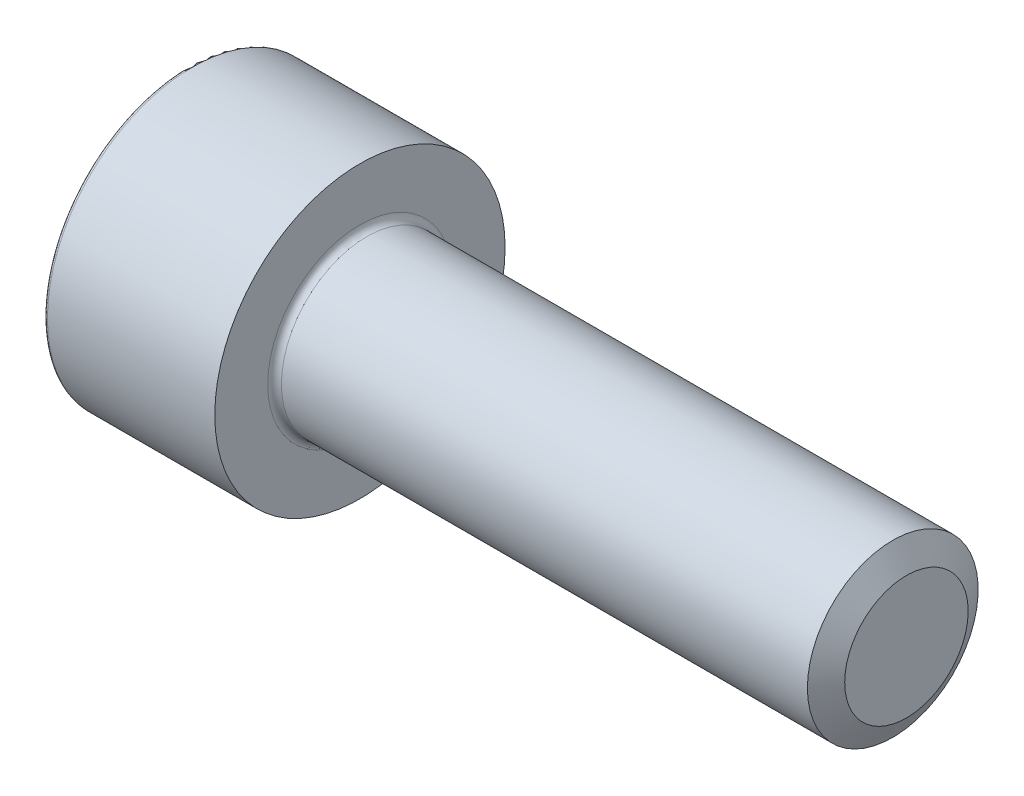
ISO-10303-21;
HEADER;
FILE_DESCRIPTION(('STEP AP214'),'2;1');
FILE_NAME('part.step','',(''),(''),'','','');
FILE_SCHEMA(('AUTOMOTIVE_DESIGN { 1 0 10303 214 1 1 1 1 }'));
ENDSEC;
DATA;
#1=APPLICATION_CONTEXT('core data for automotive mechanical design processes');
#2=APPLICATION_PROTOCOL_DEFINITION('international standard','automotive_design',2000,#1);
#3=PRODUCT_CONTEXT('',#1,'mechanical');
#4=PRODUCT('Part','Part','',(#3));
#5=PRODUCT_RELATED_PRODUCT_CATEGORY('part','',(#4));
#6=PRODUCT_DEFINITION_FORMATION('','',#4);
#7=PRODUCT_DEFINITION_CONTEXT('part definition',#1,'design');
#8=PRODUCT_DEFINITION('design','',#6,#7);
#9=PRODUCT_DEFINITION_SHAPE('','',#8);
#10=(LENGTH_UNIT() NAMED_UNIT(*) SI_UNIT(.MILLI.,.METRE.));
#11=(NAMED_UNIT(*) PLANE_ANGLE_UNIT() SI_UNIT($,.RADIAN.));
#12=(NAMED_UNIT(*) SI_UNIT($,.STERADIAN.) SOLID_ANGLE_UNIT());
#13=UNCERTAINTY_MEASURE_WITH_UNIT(LENGTH_MEASURE(1.E-05),#10,'distance_accuracy_value','');
#14=(GEOMETRIC_REPRESENTATION_CONTEXT(3) GLOBAL_UNCERTAINTY_ASSIGNED_CONTEXT((#13)) GLOBAL_UNIT_ASSIGNED_CONTEXT((#10,
#11,#12)) REPRESENTATION_CONTEXT('',''));
#15=CARTESIAN_POINT('',(0.,0.,0.));
#16=DIRECTION('',(0.,0.,1.));
#17=DIRECTION('',(1.,0.,0.));
#18=AXIS2_PLACEMENT_3D('',#15,#16,#17);
#19=CARTESIAN_POINT('',(0.,0.,0.));
#20=DIRECTION('',(-1.,0.,0.));
#21=DIRECTION('',(0.,0.,1.));
#22=AXIS2_PLACEMENT_3D('',#19,#20,#21);
#23=CYLINDRICAL_SURFACE('',#22,2.5);
#24=CARTESIAN_POINT('',(5.2,0.,0.));
#25=DIRECTION('',(-1.,0.,0.));
#26=DIRECTION('',(0.,0.,1.));
#27=AXIS2_PLACEMENT_3D('',#24,#25,#26);
#28=CIRCLE('',#27,2.5);
#29=CARTESIAN_POINT('',(5.2,0.,2.5));
#30=VERTEX_POINT('',#29);
#31=EDGE_CURVE('E159',#30,#30,#28,.T.);
#32=ORIENTED_EDGE('',*,*,#31,.F.);
#33=EDGE_LOOP('',(#32));
#34=FACE_BOUND('',#33,.T.);
#35=CARTESIAN_POINT('',(20.6000117335054,0.,0.));
#36=DIRECTION('',(-1.,0.,0.));
#37=DIRECTION('',(0.,0.,1.));
#38=AXIS2_PLACEMENT_3D('',#35,#36,#37);
#39=CIRCLE('',#38,2.5);
#40=CARTESIAN_POINT('',(20.6000117335054,0.,2.5));
#41=VERTEX_POINT('',#40);
#42=EDGE_CURVE('E293',#41,#41,#39,.T.);
#43=ORIENTED_EDGE('',*,*,#42,.T.);
#44=EDGE_LOOP('',(#43));
#45=FACE_BOUND('',#44,.T.);
#46=ADVANCED_FACE('F42',(#34,#45),#23,.T.);
#47=CARTESIAN_POINT('',(0.,0.,0.));
#48=DIRECTION('',(1.,0.,0.));
#49=DIRECTION('',(0.,0.,-1.));
#50=AXIS2_PLACEMENT_3D('',#47,#48,#49);
#51=PLANE('',#50);
#52=CARTESIAN_POINT('',(0.,0.,0.));
#53=DIRECTION('',(1.,0.,0.));
#54=DIRECTION('',(0.,0.,-1.));
#55=AXIS2_PLACEMENT_3D('',#52,#53,#54);
#56=CIRCLE('',#55,4.15);
#57=CARTESIAN_POINT('',(0.,0.,-4.15));
#58=VERTEX_POINT('',#57);
#59=EDGE_CURVE('E51',#58,#58,#56,.F.);
#60=ORIENTED_EDGE('',*,*,#59,.T.);
#61=EDGE_LOOP('',(#60));
#62=FACE_BOUND('',#61,.T.);
#63=DIRECTION('',(0.,0.866025403784439,-0.5));
#64=VECTOR('',#63,1.);
#65=CARTESIAN_POINT('',(0.,0.,2.29));
#66=LINE('',#65,#64);
#67=CARTESIAN_POINT('',(0.,0.,2.29));
#68=VERTEX_POINT('',#67);
#69=CARTESIAN_POINT('',(0.,1.98319817466637,1.145));
#70=VERTEX_POINT('',#69);
#71=EDGE_CURVE('E139',#68,#70,#66,.T.);
#72=ORIENTED_EDGE('',*,*,#71,.F.);
#73=DIRECTION('',(0.,0.866025403784439,0.5));
#74=VECTOR('',#73,1.);
#75=CARTESIAN_POINT('',(0.,-1.98319817466637,1.145));
#76=LINE('',#75,#74);
#77=CARTESIAN_POINT('',(0.,-1.98319817466637,1.145));
#78=VERTEX_POINT('',#77);
#79=EDGE_CURVE('E58',#78,#68,#76,.T.);
#80=ORIENTED_EDGE('',*,*,#79,.F.);
#81=DIRECTION('',(0.,0.,1.));
#82=VECTOR('',#81,1.);
#83=CARTESIAN_POINT('',(0.,-1.98319817466636,-1.145));
#84=LINE('',#83,#82);
#85=CARTESIAN_POINT('',(0.,-1.98319817466636,-1.145));
#86=VERTEX_POINT('',#85);
#87=EDGE_CURVE('E153',#86,#78,#84,.T.);
#88=ORIENTED_EDGE('',*,*,#87,.F.);
#89=DIRECTION('',(0.,-0.866025403784438,0.5));
#90=VECTOR('',#89,1.);
#91=CARTESIAN_POINT('',(0.,0.,-2.29));
#92=LINE('',#91,#90);
#93=CARTESIAN_POINT('',(0.,0.,-2.29));
#94=VERTEX_POINT('',#93);
#95=EDGE_CURVE('E150',#94,#86,#92,.T.);
#96=ORIENTED_EDGE('',*,*,#95,.F.);
#97=DIRECTION('',(0.,-0.866025403784439,-0.5));
#98=VECTOR('',#97,1.);
#99=CARTESIAN_POINT('',(0.,1.98319817466636,-1.145));
#100=LINE('',#99,#98);
#101=CARTESIAN_POINT('',(0.,1.98319817466636,-1.145));
#102=VERTEX_POINT('',#101);
#103=EDGE_CURVE('E106',#102,#94,#100,.T.);
#104=ORIENTED_EDGE('',*,*,#103,.F.);
#105=DIRECTION('',(0.,0.,-1.));
#106=VECTOR('',#105,1.);
#107=CARTESIAN_POINT('',(0.,1.98319817466637,1.145));
#108=LINE('',#107,#106);
#109=EDGE_CURVE('E144',#70,#102,#108,.T.);
#110=ORIENTED_EDGE('',*,*,#109,.F.);
#111=EDGE_LOOP('',(#72,#80,#88,#96,#104,#110));
#112=FACE_BOUND('',#111,.T.);
#113=ADVANCED_FACE('F183',(#62,#112),#51,.F.);
#114=CARTESIAN_POINT('',(0.,0.,0.));
#115=DIRECTION('',(-1.,0.,0.));
#116=DIRECTION('',(0.,0.,1.));
#117=AXIS2_PLACEMENT_3D('',#114,#115,#116);
#118=CYLINDRICAL_SURFACE('',#117,4.25);
#119=CARTESIAN_POINT('',(0.1,0.,0.));
#120=DIRECTION('',(1.,0.,0.));
#121=DIRECTION('',(0.,0.,-1.));
#122=AXIS2_PLACEMENT_3D('',#119,#120,#121);
#123=CIRCLE('',#122,4.25);
#124=CARTESIAN_POINT('',(0.1,0.,-4.25));
#125=VERTEX_POINT('',#124);
#126=EDGE_CURVE('E11',#125,#125,#123,.T.);
#127=ORIENTED_EDGE('',*,*,#126,.T.);
#128=EDGE_LOOP('',(#127));
#129=FACE_BOUND('',#128,.T.);
#130=CARTESIAN_POINT('',(5.,0.,0.));
#131=DIRECTION('',(-1.,0.,0.));
#132=DIRECTION('',(0.,0.,1.));
#133=AXIS2_PLACEMENT_3D('',#130,#131,#132);
#134=CIRCLE('',#133,4.25);
#135=CARTESIAN_POINT('',(5.,0.,4.25));
#136=VERTEX_POINT('',#135);
#137=EDGE_CURVE('E175',#136,#136,#134,.T.);
#138=ORIENTED_EDGE('',*,*,#137,.T.);
#139=EDGE_LOOP('',(#138));
#140=FACE_BOUND('',#139,.T.);
#141=ADVANCED_FACE('F202',(#129,#140),#118,.T.);
#142=CARTESIAN_POINT('',(5.,4.25,0.));
#143=DIRECTION('',(-1.,0.,0.));
#144=DIRECTION('',(0.,0.,1.));
#145=AXIS2_PLACEMENT_3D('',#142,#143,#144);
#146=PLANE('',#145);
#147=ORIENTED_EDGE('',*,*,#137,.F.);
#148=EDGE_LOOP('',(#147));
#149=FACE_BOUND('',#148,.T.);
#150=CARTESIAN_POINT('',(5.,0.,0.));
#151=DIRECTION('',(-1.,0.,0.));
#152=DIRECTION('',(0.,0.,1.));
#153=AXIS2_PLACEMENT_3D('',#150,#151,#152);
#154=CIRCLE('',#153,2.7);
#155=CARTESIAN_POINT('',(5.,0.,2.7));
#156=VERTEX_POINT('',#155);
#157=EDGE_CURVE('E171',#156,#156,#154,.T.);
#158=ORIENTED_EDGE('',*,*,#157,.T.);
#159=EDGE_LOOP('',(#158));
#160=FACE_BOUND('',#159,.T.);
#161=ADVANCED_FACE('F211',(#149,#160),#146,.F.);
#162=CARTESIAN_POINT('',(5.2,0.,0.));
#163=DIRECTION('',(-1.,0.,0.));
#164=DIRECTION('',(0.,0.,1.));
#165=AXIS2_PLACEMENT_3D('',#162,#163,#164);
#166=TOROIDAL_SURFACE('',#165,2.7,0.2);
#167=ORIENTED_EDGE('',*,*,#157,.F.);
#168=EDGE_LOOP('',(#167));
#169=FACE_BOUND('',#168,.T.);
#170=ORIENTED_EDGE('',*,*,#31,.T.);
#171=EDGE_LOOP('',(#170));
#172=FACE_BOUND('',#171,.T.);
#173=ADVANCED_FACE('F207',(#169,#172),#166,.F.);
#174=CARTESIAN_POINT('',(2.5,-1.98319817466637,1.145));
#175=DIRECTION('',(0.,-0.5,0.866025403784439));
#176=DIRECTION('',(0.,-0.866025403784439,-0.5));
#177=AXIS2_PLACEMENT_3D('',#174,#175,#176);
#178=PLANE('',#177);
#179=ORIENTED_EDGE('',*,*,#79,.T.);
#180=DIRECTION('',(-1.,0.,0.));
#181=VECTOR('',#180,1.);
#182=CARTESIAN_POINT('',(2.5,0.,2.29));
#183=LINE('',#182,#181);
#184=CARTESIAN_POINT('',(2.5,0.,2.29));
#185=VERTEX_POINT('',#184);
#186=EDGE_CURVE('E88',#185,#68,#183,.T.);
#187=ORIENTED_EDGE('',*,*,#186,.F.);
#188=DIRECTION('',(0.,0.866025403784439,0.5));
#189=VECTOR('',#188,1.);
#190=CARTESIAN_POINT('',(2.5,-1.98319817466637,1.145));
#191=LINE('',#190,#189);
#192=CARTESIAN_POINT('',(2.5,-1.98319817466637,1.145));
#193=VERTEX_POINT('',#192);
#194=EDGE_CURVE('E156',#193,#185,#191,.T.);
#195=ORIENTED_EDGE('',*,*,#194,.F.);
#196=DIRECTION('',(-1.,0.,0.));
#197=VECTOR('',#196,1.);
#198=CARTESIAN_POINT('',(2.5,-1.98319817466637,1.145));
#199=LINE('',#198,#197);
#200=EDGE_CURVE('E66',#193,#78,#199,.T.);
#201=ORIENTED_EDGE('',*,*,#200,.T.);
#202=EDGE_LOOP('',(#179,#187,#195,#201));
#203=FACE_BOUND('',#202,.T.);
#204=ADVANCED_FACE('F210',(#203),#178,.F.);
#205=CARTESIAN_POINT('',(2.5,-1.98319817466636,-1.145));
#206=DIRECTION('',(0.,-1.,0.));
#207=DIRECTION('',(0.,0.,-1.));
#208=AXIS2_PLACEMENT_3D('',#205,#206,#207);
#209=PLANE('',#208);
#210=ORIENTED_EDGE('',*,*,#87,.T.);
#211=ORIENTED_EDGE('',*,*,#200,.F.);
#212=DIRECTION('',(0.,0.,1.));
#213=VECTOR('',#212,1.);
#214=CARTESIAN_POINT('',(2.5,-1.98319817466636,-1.145));
#215=LINE('',#214,#213);
#216=CARTESIAN_POINT('',(2.5,-1.98319817466636,-1.145));
#217=VERTEX_POINT('',#216);
#218=EDGE_CURVE('E120',#217,#193,#215,.T.);
#219=ORIENTED_EDGE('',*,*,#218,.F.);
#220=DIRECTION('',(-1.,0.,0.));
#221=VECTOR('',#220,1.);
#222=CARTESIAN_POINT('',(2.5,-1.98319817466636,-1.145));
#223=LINE('',#222,#221);
#224=EDGE_CURVE('E111',#217,#86,#223,.T.);
#225=ORIENTED_EDGE('',*,*,#224,.T.);
#226=EDGE_LOOP('',(#210,#211,#219,#225));
#227=FACE_BOUND('',#226,.T.);
#228=ADVANCED_FACE('F239',(#227),#209,.F.);
#229=CARTESIAN_POINT('',(2.5,0.,-2.29));
#230=DIRECTION('',(0.,-0.5,-0.866025403784439));
#231=DIRECTION('',(0.,0.866025403784439,-0.5));
#232=AXIS2_PLACEMENT_3D('',#229,#230,#231);
#233=PLANE('',#232);
#234=ORIENTED_EDGE('',*,*,#95,.T.);
#235=ORIENTED_EDGE('',*,*,#224,.F.);
#236=DIRECTION('',(0.,-0.866025403784438,0.5));
#237=VECTOR('',#236,1.);
#238=CARTESIAN_POINT('',(2.5,0.,-2.29));
#239=LINE('',#238,#237);
#240=CARTESIAN_POINT('',(2.5,0.,-2.29));
#241=VERTEX_POINT('',#240);
#242=EDGE_CURVE('E115',#241,#217,#239,.T.);
#243=ORIENTED_EDGE('',*,*,#242,.F.);
#244=DIRECTION('',(-1.,0.,0.));
#245=VECTOR('',#244,1.);
#246=CARTESIAN_POINT('',(2.5,0.,-2.29));
#247=LINE('',#246,#245);
#248=EDGE_CURVE('E99',#241,#94,#247,.T.);
#249=ORIENTED_EDGE('',*,*,#248,.T.);
#250=EDGE_LOOP('',(#234,#235,#243,#249));
#251=FACE_BOUND('',#250,.T.);
#252=ADVANCED_FACE('F116',(#251),#233,.F.);
#253=CARTESIAN_POINT('',(2.5,1.98319817466636,-1.145));
#254=DIRECTION('',(0.,0.5,-0.866025403784439));
#255=DIRECTION('',(0.,0.866025403784439,0.5));
#256=AXIS2_PLACEMENT_3D('',#253,#254,#255);
#257=PLANE('',#256);
#258=ORIENTED_EDGE('',*,*,#103,.T.);
#259=ORIENTED_EDGE('',*,*,#248,.F.);
#260=DIRECTION('',(0.,-0.866025403784439,-0.5));
#261=VECTOR('',#260,1.);
#262=CARTESIAN_POINT('',(2.5,1.98319817466636,-1.145));
#263=LINE('',#262,#261);
#264=CARTESIAN_POINT('',(2.5,1.98319817466636,-1.145));
#265=VERTEX_POINT('',#264);
#266=EDGE_CURVE('E103',#265,#241,#263,.T.);
#267=ORIENTED_EDGE('',*,*,#266,.F.);
#268=DIRECTION('',(-1.,0.,0.));
#269=VECTOR('',#268,1.);
#270=CARTESIAN_POINT('',(2.5,1.98319817466636,-1.145));
#271=LINE('',#270,#269);
#272=EDGE_CURVE('E112',#265,#102,#271,.T.);
#273=ORIENTED_EDGE('',*,*,#272,.T.);
#274=EDGE_LOOP('',(#258,#259,#267,#273));
#275=FACE_BOUND('',#274,.T.);
#276=ADVANCED_FACE('F101',(#275),#257,.F.);
#277=CARTESIAN_POINT('',(2.5,1.98319817466637,1.145));
#278=DIRECTION('',(0.,1.,0.));
#279=DIRECTION('',(0.,0.,1.));
#280=AXIS2_PLACEMENT_3D('',#277,#278,#279);
#281=PLANE('',#280);
#282=ORIENTED_EDGE('',*,*,#109,.T.);
#283=ORIENTED_EDGE('',*,*,#272,.F.);
#284=DIRECTION('',(0.,0.,-1.));
#285=VECTOR('',#284,1.);
#286=CARTESIAN_POINT('',(2.5,1.98319817466637,1.145));
#287=LINE('',#286,#285);
#288=CARTESIAN_POINT('',(2.5,1.98319817466637,1.145));
#289=VERTEX_POINT('',#288);
#290=EDGE_CURVE('E126',#289,#265,#287,.T.);
#291=ORIENTED_EDGE('',*,*,#290,.F.);
#292=DIRECTION('',(-1.,0.,0.));
#293=VECTOR('',#292,1.);
#294=CARTESIAN_POINT('',(2.5,1.98319817466637,1.145));
#295=LINE('',#294,#293);
#296=EDGE_CURVE('E163',#289,#70,#295,.T.);
#297=ORIENTED_EDGE('',*,*,#296,.T.);
#298=EDGE_LOOP('',(#282,#283,#291,#297));
#299=FACE_BOUND('',#298,.T.);
#300=ADVANCED_FACE('F254',(#299),#281,.F.);
#301=CARTESIAN_POINT('',(2.5,0.,2.29));
#302=DIRECTION('',(0.,0.5,0.866025403784438));
#303=DIRECTION('',(0.,-0.866025403784438,0.5));
#304=AXIS2_PLACEMENT_3D('',#301,#302,#303);
#305=PLANE('',#304);
#306=ORIENTED_EDGE('',*,*,#71,.T.);
#307=ORIENTED_EDGE('',*,*,#296,.F.);
#308=DIRECTION('',(0.,0.866025403784439,-0.5));
#309=VECTOR('',#308,1.);
#310=CARTESIAN_POINT('',(2.5,0.,2.29));
#311=LINE('',#310,#309);
#312=EDGE_CURVE('E131',#185,#289,#311,.T.);
#313=ORIENTED_EDGE('',*,*,#312,.F.);
#314=ORIENTED_EDGE('',*,*,#186,.T.);
#315=EDGE_LOOP('',(#306,#307,#313,#314));
#316=FACE_BOUND('',#315,.T.);
#317=ADVANCED_FACE('F260',(#316),#305,.F.);
#318=CARTESIAN_POINT('',(2.5,-1.98319817466637,1.145));
#319=DIRECTION('',(1.,0.,0.));
#320=DIRECTION('',(0.,0.,-1.));
#321=AXIS2_PLACEMENT_3D('',#318,#319,#320);
#322=PLANE('',#321);
#323=ORIENTED_EDGE('',*,*,#194,.T.);
#324=ORIENTED_EDGE('',*,*,#312,.T.);
#325=ORIENTED_EDGE('',*,*,#290,.T.);
#326=ORIENTED_EDGE('',*,*,#266,.T.);
#327=ORIENTED_EDGE('',*,*,#242,.T.);
#328=ORIENTED_EDGE('',*,*,#218,.T.);
#329=EDGE_LOOP('',(#323,#324,#325,#326,#327,#328));
#330=FACE_BOUND('',#329,.T.);
#331=ADVANCED_FACE('F123',(#330),#322,.F.);
#332=CARTESIAN_POINT('',(20.6000117335054,0.,0.));
#333=DIRECTION('',(-1.,0.,0.));
#334=DIRECTION('',(0.,0.,1.));
#335=AXIS2_PLACEMENT_3D('',#332,#333,#334);
#336=CONICAL_SURFACE('',#335,2.5,1.04719755119659);
#337=CARTESIAN_POINT('',(21.,0.,0.));
#338=DIRECTION('',(-1.,0.,0.));
#339=DIRECTION('',(0.,0.,1.));
#340=AXIS2_PLACEMENT_3D('',#337,#338,#339);
#341=CIRCLE('',#340,1.8072);
#342=CARTESIAN_POINT('',(21.,0.,1.8072));
#343=VERTEX_POINT('',#342);
#344=EDGE_CURVE('E140',#343,#343,#341,.T.);
#345=ORIENTED_EDGE('',*,*,#344,.T.);
#346=EDGE_LOOP('',(#345));
#347=FACE_BOUND('',#346,.T.);
#348=ORIENTED_EDGE('',*,*,#42,.F.);
#349=EDGE_LOOP('',(#348));
#350=FACE_BOUND('',#349,.T.);
#351=ADVANCED_FACE('F192',(#347,#350),#336,.T.);
#352=CARTESIAN_POINT('',(21.,2.5,0.));
#353=DIRECTION('',(-1.,0.,0.));
#354=DIRECTION('',(0.,0.,1.));
#355=AXIS2_PLACEMENT_3D('',#352,#353,#354);
#356=PLANE('',#355);
#357=ORIENTED_EDGE('',*,*,#344,.F.);
#358=EDGE_LOOP('',(#357));
#359=FACE_BOUND('',#358,.T.);
#360=ADVANCED_FACE('F187',(#359),#356,.F.);
#361=CARTESIAN_POINT('',(0.1,0.,0.));
#362=DIRECTION('',(1.,0.,0.));
#363=DIRECTION('',(0.,0.,-1.));
#364=AXIS2_PLACEMENT_3D('',#361,#362,#363);
#365=TOROIDAL_SURFACE('',#364,4.15,0.1);
#366=ORIENTED_EDGE('',*,*,#126,.F.);
#367=EDGE_LOOP('',(#366));
#368=FACE_BOUND('',#367,.T.);
#369=ORIENTED_EDGE('',*,*,#59,.F.);
#370=EDGE_LOOP('',(#369));
#371=FACE_BOUND('',#370,.T.);
#372=ADVANCED_FACE('F44',(#368,#371),#365,.T.);
#373=CLOSED_SHELL('',(#46,#113,#141,#161,#173,#204,#228,#252,#276,#300,#317,#331,#351,#360,#372));
#374=MANIFOLD_SOLID_BREP('B2',#373);
#375=ADVANCED_BREP_SHAPE_REPRESENTATION('',(#18,#374),#14);
#376=SHAPE_DEFINITION_REPRESENTATION(#9,#375);
ENDSEC;
END-ISO-10303-21;
